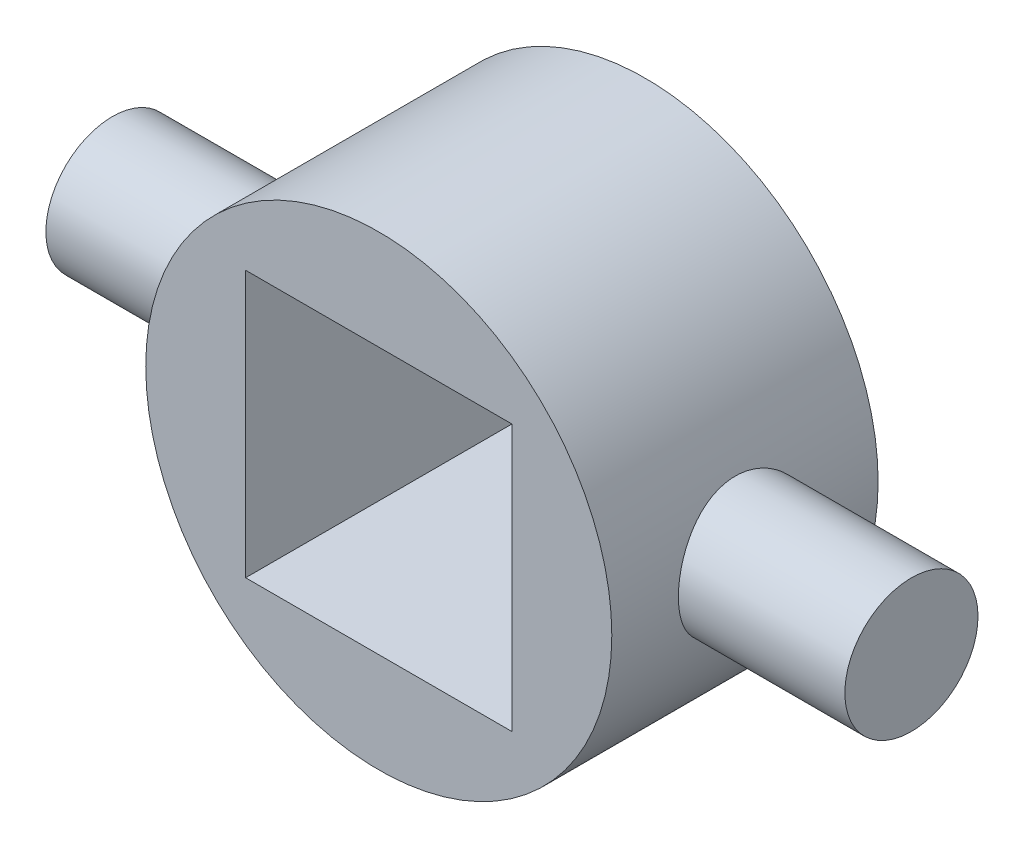
ISO-10303-21;
HEADER;
FILE_DESCRIPTION(('STEP AP214'),'2;1');
FILE_NAME('part.step','',(''),(''),'','','');
FILE_SCHEMA(('AUTOMOTIVE_DESIGN { 1 0 10303 214 1 1 1 1 }'));
ENDSEC;
DATA;
#1=APPLICATION_CONTEXT('core data for automotive mechanical design processes');
#2=APPLICATION_PROTOCOL_DEFINITION('international standard','automotive_design',2000,#1);
#3=PRODUCT_CONTEXT('',#1,'mechanical');
#4=PRODUCT('Part','Part','',(#3));
#5=PRODUCT_RELATED_PRODUCT_CATEGORY('part','',(#4));
#6=PRODUCT_DEFINITION_FORMATION('','',#4);
#7=PRODUCT_DEFINITION_CONTEXT('part definition',#1,'design');
#8=PRODUCT_DEFINITION('design','',#6,#7);
#9=PRODUCT_DEFINITION_SHAPE('','',#8);
#10=(LENGTH_UNIT() NAMED_UNIT(*) SI_UNIT(.MILLI.,.METRE.));
#11=(NAMED_UNIT(*) PLANE_ANGLE_UNIT() SI_UNIT($,.RADIAN.));
#12=(NAMED_UNIT(*) SI_UNIT($,.STERADIAN.) SOLID_ANGLE_UNIT());
#13=UNCERTAINTY_MEASURE_WITH_UNIT(LENGTH_MEASURE(1.E-05),#10,'distance_accuracy_value','');
#14=(GEOMETRIC_REPRESENTATION_CONTEXT(3) GLOBAL_UNCERTAINTY_ASSIGNED_CONTEXT((#13)) GLOBAL_UNIT_ASSIGNED_CONTEXT((#10,
#11,#12)) REPRESENTATION_CONTEXT('',''));
#15=CARTESIAN_POINT('',(0.,0.,0.));
#16=DIRECTION('',(0.,0.,1.));
#17=DIRECTION('',(1.,0.,0.));
#18=AXIS2_PLACEMENT_3D('',#15,#16,#17);
#19=CARTESIAN_POINT('',(0.,0.,20.));
#20=DIRECTION('',(0.,0.,-1.));
#21=DIRECTION('',(-1.,0.,0.));
#22=AXIS2_PLACEMENT_3D('',#19,#20,#21);
#23=CYLINDRICAL_SURFACE('',#22,17.5);
#24=CARTESIAN_POINT('',(-17.5,0.,15.));
#25=CARTESIAN_POINT('',(-17.4999967323586,-0.274887255943128,14.9999951510951));
#26=CARTESIAN_POINT('',(-17.4934604350511,-0.549824369681454,14.9772555275597));
#27=CARTESIAN_POINT('',(-17.4680226486276,-1.09172997799247,14.8870893247442));
#28=CARTESIAN_POINT('',(-17.4491164802521,-1.35869541707404,14.8196458348148));
#29=CARTESIAN_POINT('',(-17.4010172837268,-1.87676075184468,14.6424799039587));
#30=CARTESIAN_POINT('',(-17.3718386026585,-2.12788220212056,14.5328164096201));
#31=CARTESIAN_POINT('',(-17.3062494579136,-2.60817190282318,14.2745550213041));
#32=CARTESIAN_POINT('',(-17.2698382377007,-2.83733785294541,14.1259530537741));
#33=CARTESIAN_POINT('',(-17.1926183656394,-3.27323611714736,13.7899124733177));
#34=CARTESIAN_POINT('',(-17.1517260486293,-3.47930930595233,13.6016381153618));
#35=CARTESIAN_POINT('',(-17.0706683728915,-3.85742839481089,13.1933806421558));
#36=CARTESIAN_POINT('',(-17.0305031239854,-4.02946919269461,12.9733927809195));
#37=CARTESIAN_POINT('',(-16.9545753718829,-4.33799475016071,12.5025160430226));
#38=CARTESIAN_POINT('',(-16.9189175626436,-4.47369552758351,12.2510950373375));
#39=CARTESIAN_POINT('',(-16.8572835960235,-4.7006292638497,11.7278199706235));
#40=CARTESIAN_POINT('',(-16.8313053561473,-4.79187178889368,11.4559703198242));
#41=CARTESIAN_POINT('',(-16.7928402048755,-4.92496082534619,10.9069130920848));
#42=CARTESIAN_POINT('',(-16.7800244641586,-4.9680138300687,10.6300215930753));
#43=CARTESIAN_POINT('',(-16.7683552051415,-5.00726669473215,10.0726721288899));
#44=CARTESIAN_POINT('',(-16.769498653032,-5.00347673524998,9.79221495189357));
#45=CARTESIAN_POINT('',(-16.7853258599179,-4.95010336906261,9.24532847133277));
#46=CARTESIAN_POINT('',(-16.7995695662338,-4.90200814317314,8.9787391219636));
#47=CARTESIAN_POINT('',(-16.8392837083571,-4.76378465210904,8.45758195085061));
#48=CARTESIAN_POINT('',(-16.8647551590827,-4.67365258702332,8.20301521818008));
#49=CARTESIAN_POINT('',(-16.9244215882327,-4.45276702845641,7.70938438894628));
#50=CARTESIAN_POINT('',(-16.95872291023,-4.32151377932501,7.47055731900275));
#51=CARTESIAN_POINT('',(-17.0321304219627,-4.02245947919414,7.01780859695957));
#52=CARTESIAN_POINT('',(-17.0712376805236,-3.85465029183281,6.80389250566084));
#53=CARTESIAN_POINT('',(-17.151656266434,-3.47975999182637,6.39856906098605));
#54=CARTESIAN_POINT('',(-17.1929951143159,-3.27143718711355,6.20831381008246));
#55=CARTESIAN_POINT('',(-17.2719061804519,-2.82533070596534,5.86518499089878));
#56=CARTESIAN_POINT('',(-17.3094782034438,-2.58754550370467,5.71231335989559));
#57=CARTESIAN_POINT('',(-17.3769132016394,-2.08730768272867,5.44767816306506));
#58=CARTESIAN_POINT('',(-17.4067318874312,-1.82472454452503,5.33614928298958));
#59=CARTESIAN_POINT('',(-17.4549812871891,-1.28348307491866,5.15916527145791));
#60=CARTESIAN_POINT('',(-17.4734148714063,-1.00482881452536,5.09369852688682));
#61=CARTESIAN_POINT('',(-17.4963718628669,-0.449165971610879,5.01256678572638));
#62=CARTESIAN_POINT('',(-17.501331821265,-0.172403367151271,4.99533826156744));
#63=CARTESIAN_POINT('',(-17.4980521176773,0.380066317013958,5.00681816575261));
#64=CARTESIAN_POINT('',(-17.4898140395157,0.655773519392769,5.03552108211481));
#65=CARTESIAN_POINT('',(-17.4613481671301,1.19254658357579,5.13677611079064));
#66=CARTESIAN_POINT('',(-17.4413653254419,1.45379552933711,5.20843295330849));
#67=CARTESIAN_POINT('',(-17.3916999685472,1.9605217155141,5.39250125496169));
#68=CARTESIAN_POINT('',(-17.3620163316471,2.20599712812179,5.50491742722334));
#69=CARTESIAN_POINT('',(-17.2952490292284,2.68010421280008,5.77005834161282));
#70=CARTESIAN_POINT('',(-17.2580190794575,2.90825621635022,5.92360299706335));
#71=CARTESIAN_POINT('',(-17.180448677462,3.33609632014869,6.26563126487773));
#72=CARTESIAN_POINT('',(-17.1401075188813,3.53577792710763,6.45412282516136));
#73=CARTESIAN_POINT('',(-17.0592154907323,3.90776607085016,6.86802335512367));
#74=CARTESIAN_POINT('',(-17.0187009214433,4.07896356851775,7.09443818889789));
#75=CARTESIAN_POINT('',(-16.9434723683839,4.380988290169,7.57365647156141));
#76=CARTESIAN_POINT('',(-16.9087581828186,4.51181691871704,7.82645900192717));
#77=CARTESIAN_POINT('',(-16.8494662810178,4.72843635295665,8.35022802743902));
#78=CARTESIAN_POINT('',(-16.8248350005383,4.81446583099021,8.6210894087477));
#79=CARTESIAN_POINT('',(-16.7885614169356,4.93948625169788,9.17427483893333));
#80=CARTESIAN_POINT('',(-16.7769151780959,4.9784914475439,9.45659538767741));
#81=CARTESIAN_POINT('',(-16.7682925774812,5.00745060616827,10.0132400823757));
#82=CARTESIAN_POINT('',(-16.7707790176036,4.99920069109392,10.2874637614812));
#83=CARTESIAN_POINT('',(-16.7888649275624,4.93811777392153,10.8304368267331));
#84=CARTESIAN_POINT('',(-16.8044639598361,4.88528625949613,11.0991863952422));
#85=CARTESIAN_POINT('',(-16.8466744296963,4.73764922042289,11.6209459278904));
#86=CARTESIAN_POINT('',(-16.8731719264076,4.64327729466074,11.8740884675196));
#87=CARTESIAN_POINT('',(-16.9341825708695,4.41557373253792,12.3611468362388));
#88=CARTESIAN_POINT('',(-16.9686971370099,4.28223520107837,12.5950592531853));
#89=CARTESIAN_POINT('',(-17.0432917237999,3.97516366337116,13.045458804511));
#90=CARTESIAN_POINT('',(-17.0835190794904,3.80023069306842,13.2611034783543));
#91=CARTESIAN_POINT('',(-17.164246127292,3.41714960094824,13.6605597395252));
#92=CARTESIAN_POINT('',(-17.2047458854255,3.20899312682136,13.8443632977772));
#93=CARTESIAN_POINT('',(-17.282698989313,2.75893580216352,14.1795929608164));
#94=CARTESIAN_POINT('',(-17.3200475259364,2.51630625589946,14.330067468174));
#95=CARTESIAN_POINT('',(-17.3862848944483,2.00812632411664,14.5878644625551));
#96=CARTESIAN_POINT('',(-17.4151783467569,1.74258856028685,14.6952105298327));
#97=CARTESIAN_POINT('',(-17.4581836181329,1.23229078833759,14.8521188784886));
#98=CARTESIAN_POINT('',(-17.473742109052,0.989407519060976,14.9074338417114));
#99=CARTESIAN_POINT('',(-17.4946510963036,0.497695921965917,14.9813741431054));
#100=CARTESIAN_POINT('',(-17.5000029583499,0.248868394040229,15.0000043899422));
#101=CARTESIAN_POINT('',(-17.5,0.,15.));
#102=B_SPLINE_CURVE_WITH_KNOTS('',3,(#24,#25,#26,#27,#28,#29,#30,#31,#32,#33,#34,#35,#36,#37,
#38,#39,#40,#41,#42,#43,#44,#45,#46,#47,#48,#49,#50,#51,#52,#53,#54,#55,#56,#57,#58,#59,#60,#61,
#62,#63,#64,#65,#66,#67,#68,#69,#70,#71,#72,#73,#74,#75,#76,#77,#78,#79,#80,#81,#82,#83,#84,#85,
#86,#87,#88,#89,#90,#91,#92,#93,#94,#95,#96,#97,#98,#99,#100,#101),.UNSPECIFIED.,.T.,.F.,(4,2,2,
2,2,2,2,2,2,2,2,2,2,2,2,2,2,2,2,2,2,2,2,2,2,2,2,2,2,2,2,2,2,2,2,2,2,2,4),(0.,0.82374828135586,
1.64780834948795,2.47072203223836,3.29372183858789,4.13619528826953,4.97879494684284,
5.83832688250143,6.69767378862024,7.53498774656874,8.37211973078083,9.18211964575845,
9.99219279470076,10.8125200823279,11.6330301394812,12.4844625151102,13.3359390039338,
14.1921775276588,15.0482001004129,15.8761364425026,16.7039734359138,17.5151285120356,
18.3263774144358,19.1551881336589,19.9841875797423,20.840302622156,21.6963878741801,
22.5478643342011,23.399082644741,24.2181670405214,25.0372241048183,25.8479274074505,
26.6587742501083,27.4966914224279,28.3348195778807,29.1944494744229,30.053608731021,
30.7994867011175,31.5452648608618),.UNSPECIFIED.);
#103=CARTESIAN_POINT('',(-17.5,0.,15.));
#104=VERTEX_POINT('',#103);
#105=EDGE_CURVE('E151',#104,#104,#102,.T.);
#106=ORIENTED_EDGE('',*,*,#105,.T.);
#107=EDGE_LOOP('',(#106));
#108=FACE_BOUND('',#107,.T.);
#109=CARTESIAN_POINT('',(0.,0.,20.));
#110=DIRECTION('',(0.,0.,1.));
#111=DIRECTION('',(1.,0.,0.));
#112=AXIS2_PLACEMENT_3D('',#109,#110,#111);
#113=CIRCLE('',#112,17.5);
#114=CARTESIAN_POINT('',(17.5,0.,20.));
#115=VERTEX_POINT('',#114);
#116=EDGE_CURVE('E46',#115,#115,#113,.T.);
#117=ORIENTED_EDGE('',*,*,#116,.F.);
#118=EDGE_LOOP('',(#117));
#119=FACE_BOUND('',#118,.T.);
#120=CARTESIAN_POINT('',(0.,0.,0.));
#121=DIRECTION('',(0.,0.,1.));
#122=DIRECTION('',(1.,0.,0.));
#123=AXIS2_PLACEMENT_3D('',#120,#121,#122);
#124=CIRCLE('',#123,17.5);
#125=CARTESIAN_POINT('',(17.5,0.,0.));
#126=VERTEX_POINT('',#125);
#127=EDGE_CURVE('E95',#126,#126,#124,.T.);
#128=ORIENTED_EDGE('',*,*,#127,.T.);
#129=EDGE_LOOP('',(#128));
#130=FACE_BOUND('',#129,.T.);
#131=CARTESIAN_POINT('',(17.5,0.,15.));
#132=CARTESIAN_POINT('',(17.4999967323586,-0.274887255943128,14.9999951510951));
#133=CARTESIAN_POINT('',(17.4934604350511,-0.549824369681454,14.9772555275597));
#134=CARTESIAN_POINT('',(17.4680226486276,-1.09172997799247,14.8870893247442));
#135=CARTESIAN_POINT('',(17.4491164802521,-1.35869541707404,14.8196458348148));
#136=CARTESIAN_POINT('',(17.4010172837268,-1.87676075184468,14.6424799039587));
#137=CARTESIAN_POINT('',(17.3718386026585,-2.12788220212056,14.5328164096201));
#138=CARTESIAN_POINT('',(17.3062494579136,-2.60817190282318,14.2745550213041));
#139=CARTESIAN_POINT('',(17.2698382377007,-2.83733785294541,14.1259530537741));
#140=CARTESIAN_POINT('',(17.1926183656394,-3.27323611714736,13.7899124733177));
#141=CARTESIAN_POINT('',(17.1517260486293,-3.47930930595233,13.6016381153618));
#142=CARTESIAN_POINT('',(17.0706683728915,-3.85742839481089,13.1933806421558));
#143=CARTESIAN_POINT('',(17.0305031239854,-4.02946919269461,12.9733927809195));
#144=CARTESIAN_POINT('',(16.9545753718829,-4.33799475016071,12.5025160430226));
#145=CARTESIAN_POINT('',(16.9189175626436,-4.47369552758351,12.2510950373375));
#146=CARTESIAN_POINT('',(16.8572835960235,-4.7006292638497,11.7278199706235));
#147=CARTESIAN_POINT('',(16.8313053561473,-4.79187178889368,11.4559703198242));
#148=CARTESIAN_POINT('',(16.7928402048755,-4.92496082534619,10.9069130920848));
#149=CARTESIAN_POINT('',(16.7800244641586,-4.9680138300687,10.6300215930753));
#150=CARTESIAN_POINT('',(16.7683552051415,-5.00726669473215,10.0726721288899));
#151=CARTESIAN_POINT('',(16.769498653032,-5.00347673524998,9.79221495189357));
#152=CARTESIAN_POINT('',(16.7853258599179,-4.95010336906261,9.24532847133277));
#153=CARTESIAN_POINT('',(16.7995695662338,-4.90200814317314,8.9787391219636));
#154=CARTESIAN_POINT('',(16.8392837083571,-4.76378465210904,8.45758195085061));
#155=CARTESIAN_POINT('',(16.8647551590827,-4.67365258702332,8.20301521818008));
#156=CARTESIAN_POINT('',(16.9244215882327,-4.45276702845641,7.70938438894628));
#157=CARTESIAN_POINT('',(16.95872291023,-4.32151377932501,7.47055731900275));
#158=CARTESIAN_POINT('',(17.0321304219627,-4.02245947919413,7.01780859695957));
#159=CARTESIAN_POINT('',(17.0712376805236,-3.85465029183281,6.80389250566084));
#160=CARTESIAN_POINT('',(17.151656266434,-3.47975999182637,6.39856906098605));
#161=CARTESIAN_POINT('',(17.1929951143159,-3.27143718711354,6.20831381008246));
#162=CARTESIAN_POINT('',(17.2719061804519,-2.82533070596534,5.86518499089878));
#163=CARTESIAN_POINT('',(17.3094782034438,-2.58754550370467,5.71231335989559));
#164=CARTESIAN_POINT('',(17.3769132016394,-2.08730768272867,5.44767816306506));
#165=CARTESIAN_POINT('',(17.4067318874312,-1.82472454452503,5.33614928298958));
#166=CARTESIAN_POINT('',(17.4549812871892,-1.28348307491865,5.15916527145791));
#167=CARTESIAN_POINT('',(17.4734148714063,-1.00482881452536,5.09369852688682));
#168=CARTESIAN_POINT('',(17.4963718628669,-0.449165971610878,5.01256678572638));
#169=CARTESIAN_POINT('',(17.501331821265,-0.172403367151271,4.99533826156744));
#170=CARTESIAN_POINT('',(17.4980521176773,0.380066317013958,5.00681816575261));
#171=CARTESIAN_POINT('',(17.4898140395157,0.65577351939277,5.03552108211481));
#172=CARTESIAN_POINT('',(17.4613481671301,1.19254658357579,5.13677611079064));
#173=CARTESIAN_POINT('',(17.4413653254419,1.45379552933711,5.20843295330849));
#174=CARTESIAN_POINT('',(17.3916999685472,1.9605217155141,5.39250125496169));
#175=CARTESIAN_POINT('',(17.3620163316471,2.20599712812179,5.50491742722334));
#176=CARTESIAN_POINT('',(17.2952490292284,2.68010421280008,5.77005834161282));
#177=CARTESIAN_POINT('',(17.2580190794575,2.90825621635022,5.92360299706335));
#178=CARTESIAN_POINT('',(17.180448677462,3.33609632014869,6.26563126487773));
#179=CARTESIAN_POINT('',(17.1401075188813,3.53577792710763,6.45412282516136));
#180=CARTESIAN_POINT('',(17.0592154907323,3.90776607085016,6.86802335512367));
#181=CARTESIAN_POINT('',(17.0187009214433,4.07896356851775,7.09443818889789));
#182=CARTESIAN_POINT('',(16.9434723683839,4.380988290169,7.57365647156141));
#183=CARTESIAN_POINT('',(16.9087581828186,4.51181691871704,7.82645900192717));
#184=CARTESIAN_POINT('',(16.8494662810178,4.72843635295665,8.35022802743902));
#185=CARTESIAN_POINT('',(16.8248350005383,4.81446583099021,8.6210894087477));
#186=CARTESIAN_POINT('',(16.7885614169356,4.93948625169788,9.17427483893333));
#187=CARTESIAN_POINT('',(16.7769151780959,4.9784914475439,9.45659538767741));
#188=CARTESIAN_POINT('',(16.7682925774812,5.00745060616827,10.0132400823757));
#189=CARTESIAN_POINT('',(16.7707790176036,4.99920069109392,10.2874637614812));
#190=CARTESIAN_POINT('',(16.7888649275624,4.93811777392153,10.8304368267331));
#191=CARTESIAN_POINT('',(16.8044639598361,4.88528625949613,11.0991863952422));
#192=CARTESIAN_POINT('',(16.8466744296963,4.73764922042289,11.6209459278904));
#193=CARTESIAN_POINT('',(16.8731719264076,4.64327729466074,11.8740884675196));
#194=CARTESIAN_POINT('',(16.9341825708695,4.41557373253792,12.3611468362388));
#195=CARTESIAN_POINT('',(16.9686971370099,4.28223520107837,12.5950592531853));
#196=CARTESIAN_POINT('',(17.0432917237999,3.97516366337116,13.045458804511));
#197=CARTESIAN_POINT('',(17.0835190794904,3.80023069306842,13.2611034783543));
#198=CARTESIAN_POINT('',(17.164246127292,3.41714960094824,13.6605597395252));
#199=CARTESIAN_POINT('',(17.2047458854255,3.20899312682136,13.8443632977772));
#200=CARTESIAN_POINT('',(17.282698989313,2.75893580216352,14.1795929608164));
#201=CARTESIAN_POINT('',(17.3200475259364,2.51630625589946,14.330067468174));
#202=CARTESIAN_POINT('',(17.3862848944483,2.00812632411664,14.5878644625551));
#203=CARTESIAN_POINT('',(17.4151783467569,1.74258856028684,14.6952105298327));
#204=CARTESIAN_POINT('',(17.4581836181329,1.23229078833759,14.8521188784886));
#205=CARTESIAN_POINT('',(17.473742109052,0.989407519060977,14.9074338417114));
#206=CARTESIAN_POINT('',(17.4946510963036,0.497695921965918,14.9813741431054));
#207=CARTESIAN_POINT('',(17.5000029583499,0.248868394040229,15.0000043899422));
#208=CARTESIAN_POINT('',(17.5,0.,15.));
#209=B_SPLINE_CURVE_WITH_KNOTS('',3,(#131,#132,#133,#134,#135,#136,#137,#138,#139,#140,#141,
#142,#143,#144,#145,#146,#147,#148,#149,#150,#151,#152,#153,#154,#155,#156,#157,#158,#159,#160,
#161,#162,#163,#164,#165,#166,#167,#168,#169,#170,#171,#172,#173,#174,#175,#176,#177,#178,#179,
#180,#181,#182,#183,#184,#185,#186,#187,#188,#189,#190,#191,#192,#193,#194,#195,#196,#197,#198,
#199,#200,#201,#202,#203,#204,#205,#206,#207,#208),.UNSPECIFIED.,.T.,.F.,(4,2,2,2,2,2,2,2,2,2,2,
2,2,2,2,2,2,2,2,2,2,2,2,2,2,2,2,2,2,2,2,2,2,2,2,2,2,2,4),(0.,0.82374828135586,1.64780834948795,
2.47072203223836,3.29372183858789,4.13619528826953,4.97879494684284,5.83832688250143,
6.69767378862024,7.53498774656874,8.37211973078083,9.18211964575845,9.99219279470076,
10.8125200823279,11.6330301394812,12.4844625151102,13.3359390039338,14.1921775276588,
15.0482001004129,15.8761364425026,16.7039734359138,17.5151285120356,18.3263774144358,
19.1551881336589,19.9841875797423,20.840302622156,21.6963878741801,22.5478643342011,
23.399082644741,24.2181670405214,25.0372241048183,25.8479274074505,26.6587742501083,
27.4966914224279,28.3348195778807,29.1944494744229,30.0536087310211,30.7994867011175,
31.5452648608618),.UNSPECIFIED.);
#210=CARTESIAN_POINT('',(17.5,0.,15.));
#211=VERTEX_POINT('',#210);
#212=EDGE_CURVE('E11',#211,#211,#209,.T.);
#213=ORIENTED_EDGE('',*,*,#212,.F.);
#214=EDGE_LOOP('',(#213));
#215=FACE_BOUND('',#214,.T.);
#216=ADVANCED_FACE('F34',(#108,#119,#130,#215),#23,.T.);
#217=CARTESIAN_POINT('',(0.,0.,20.));
#218=DIRECTION('',(0.,0.,1.));
#219=DIRECTION('',(1.,0.,0.));
#220=AXIS2_PLACEMENT_3D('',#217,#218,#219);
#221=PLANE('',#220);
#222=ORIENTED_EDGE('',*,*,#116,.T.);
#223=EDGE_LOOP('',(#222));
#224=FACE_BOUND('',#223,.T.);
#225=DIRECTION('',(-1.,0.,0.));
#226=VECTOR('',#225,1.);
#227=CARTESIAN_POINT('',(-10.,10.,20.));
#228=LINE('',#227,#226);
#229=CARTESIAN_POINT('',(10.,10.,20.));
#230=VERTEX_POINT('',#229);
#231=CARTESIAN_POINT('',(-10.,10.,20.));
#232=VERTEX_POINT('',#231);
#233=EDGE_CURVE('E87',#230,#232,#228,.T.);
#234=ORIENTED_EDGE('',*,*,#233,.F.);
#235=DIRECTION('',(0.,1.,0.));
#236=VECTOR('',#235,1.);
#237=CARTESIAN_POINT('',(10.,-10.,20.));
#238=LINE('',#237,#236);
#239=CARTESIAN_POINT('',(10.,-10.,20.));
#240=VERTEX_POINT('',#239);
#241=EDGE_CURVE('E79',#240,#230,#238,.T.);
#242=ORIENTED_EDGE('',*,*,#241,.F.);
#243=DIRECTION('',(1.,0.,0.));
#244=VECTOR('',#243,1.);
#245=CARTESIAN_POINT('',(-10.,-10.,20.));
#246=LINE('',#245,#244);
#247=CARTESIAN_POINT('',(-10.,-10.,20.));
#248=VERTEX_POINT('',#247);
#249=EDGE_CURVE('E102',#248,#240,#246,.T.);
#250=ORIENTED_EDGE('',*,*,#249,.F.);
#251=DIRECTION('',(0.,-1.,0.));
#252=VECTOR('',#251,1.);
#253=CARTESIAN_POINT('',(-10.,-10.,20.));
#254=LINE('',#253,#252);
#255=EDGE_CURVE('E100',#232,#248,#254,.T.);
#256=ORIENTED_EDGE('',*,*,#255,.F.);
#257=EDGE_LOOP('',(#234,#242,#250,#256));
#258=FACE_BOUND('',#257,.T.);
#259=ADVANCED_FACE('F99',(#224,#258),#221,.T.);
#260=CARTESIAN_POINT('',(0.,0.,0.));
#261=DIRECTION('',(0.,0.,1.));
#262=DIRECTION('',(1.,0.,0.));
#263=AXIS2_PLACEMENT_3D('',#260,#261,#262);
#264=PLANE('',#263);
#265=ORIENTED_EDGE('',*,*,#127,.F.);
#266=EDGE_LOOP('',(#265));
#267=FACE_BOUND('',#266,.T.);
#268=DIRECTION('',(0.,1.,0.));
#269=VECTOR('',#268,1.);
#270=CARTESIAN_POINT('',(10.,-10.,0.));
#271=LINE('',#270,#269);
#272=CARTESIAN_POINT('',(10.,-10.,0.));
#273=VERTEX_POINT('',#272);
#274=CARTESIAN_POINT('',(10.,10.,0.));
#275=VERTEX_POINT('',#274);
#276=EDGE_CURVE('E61',#273,#275,#271,.T.);
#277=ORIENTED_EDGE('',*,*,#276,.T.);
#278=DIRECTION('',(-1.,0.,0.));
#279=VECTOR('',#278,1.);
#280=CARTESIAN_POINT('',(-10.,10.,0.));
#281=LINE('',#280,#279);
#282=CARTESIAN_POINT('',(-10.,10.,0.));
#283=VERTEX_POINT('',#282);
#284=EDGE_CURVE('E94',#275,#283,#281,.T.);
#285=ORIENTED_EDGE('',*,*,#284,.T.);
#286=DIRECTION('',(0.,-1.,0.));
#287=VECTOR('',#286,1.);
#288=CARTESIAN_POINT('',(-10.,-10.,0.));
#289=LINE('',#288,#287);
#290=CARTESIAN_POINT('',(-10.,-10.,0.));
#291=VERTEX_POINT('',#290);
#292=EDGE_CURVE('E110',#283,#291,#289,.T.);
#293=ORIENTED_EDGE('',*,*,#292,.T.);
#294=DIRECTION('',(1.,0.,0.));
#295=VECTOR('',#294,1.);
#296=CARTESIAN_POINT('',(-10.,-10.,0.));
#297=LINE('',#296,#295);
#298=EDGE_CURVE('E88',#291,#273,#297,.T.);
#299=ORIENTED_EDGE('',*,*,#298,.T.);
#300=EDGE_LOOP('',(#277,#285,#293,#299));
#301=FACE_BOUND('',#300,.T.);
#302=ADVANCED_FACE('F124',(#267,#301),#264,.F.);
#303=CARTESIAN_POINT('',(10.,-10.,20.));
#304=DIRECTION('',(-1.,0.,0.));
#305=DIRECTION('',(0.,0.,1.));
#306=AXIS2_PLACEMENT_3D('',#303,#304,#305);
#307=PLANE('',#306);
#308=ORIENTED_EDGE('',*,*,#276,.F.);
#309=DIRECTION('',(0.,0.,-1.));
#310=VECTOR('',#309,1.);
#311=CARTESIAN_POINT('',(10.,-10.,20.));
#312=LINE('',#311,#310);
#313=EDGE_CURVE('E83',#240,#273,#312,.T.);
#314=ORIENTED_EDGE('',*,*,#313,.F.);
#315=ORIENTED_EDGE('',*,*,#241,.T.);
#316=DIRECTION('',(0.,0.,-1.));
#317=VECTOR('',#316,1.);
#318=CARTESIAN_POINT('',(10.,10.,20.));
#319=LINE('',#318,#317);
#320=EDGE_CURVE('E82',#230,#275,#319,.T.);
#321=ORIENTED_EDGE('',*,*,#320,.T.);
#322=EDGE_LOOP('',(#308,#314,#315,#321));
#323=FACE_BOUND('',#322,.T.);
#324=ADVANCED_FACE('F81',(#323),#307,.T.);
#325=CARTESIAN_POINT('',(-10.,10.,20.));
#326=DIRECTION('',(0.,-1.,0.));
#327=DIRECTION('',(0.,0.,-1.));
#328=AXIS2_PLACEMENT_3D('',#325,#326,#327);
#329=PLANE('',#328);
#330=ORIENTED_EDGE('',*,*,#284,.F.);
#331=ORIENTED_EDGE('',*,*,#320,.F.);
#332=ORIENTED_EDGE('',*,*,#233,.T.);
#333=DIRECTION('',(0.,0.,-1.));
#334=VECTOR('',#333,1.);
#335=CARTESIAN_POINT('',(-10.,10.,20.));
#336=LINE('',#335,#334);
#337=EDGE_CURVE('E96',#232,#283,#336,.T.);
#338=ORIENTED_EDGE('',*,*,#337,.T.);
#339=EDGE_LOOP('',(#330,#331,#332,#338));
#340=FACE_BOUND('',#339,.T.);
#341=ADVANCED_FACE('F91',(#340),#329,.T.);
#342=CARTESIAN_POINT('',(-10.,-10.,20.));
#343=DIRECTION('',(1.,0.,0.));
#344=DIRECTION('',(0.,0.,-1.));
#345=AXIS2_PLACEMENT_3D('',#342,#343,#344);
#346=PLANE('',#345);
#347=ORIENTED_EDGE('',*,*,#292,.F.);
#348=ORIENTED_EDGE('',*,*,#337,.F.);
#349=ORIENTED_EDGE('',*,*,#255,.T.);
#350=DIRECTION('',(0.,0.,-1.));
#351=VECTOR('',#350,1.);
#352=CARTESIAN_POINT('',(-10.,-10.,20.));
#353=LINE('',#352,#351);
#354=EDGE_CURVE('E53',#248,#291,#353,.T.);
#355=ORIENTED_EDGE('',*,*,#354,.T.);
#356=EDGE_LOOP('',(#347,#348,#349,#355));
#357=FACE_BOUND('',#356,.T.);
#358=ADVANCED_FACE('F131',(#357),#346,.T.);
#359=CARTESIAN_POINT('',(-10.,-10.,20.));
#360=DIRECTION('',(0.,1.,0.));
#361=DIRECTION('',(0.,0.,1.));
#362=AXIS2_PLACEMENT_3D('',#359,#360,#361);
#363=PLANE('',#362);
#364=ORIENTED_EDGE('',*,*,#298,.F.);
#365=ORIENTED_EDGE('',*,*,#354,.F.);
#366=ORIENTED_EDGE('',*,*,#249,.T.);
#367=ORIENTED_EDGE('',*,*,#313,.T.);
#368=EDGE_LOOP('',(#364,#365,#366,#367));
#369=FACE_BOUND('',#368,.T.);
#370=ADVANCED_FACE('F128',(#369),#363,.T.);
#371=CARTESIAN_POINT('',(30.,0.,10.));
#372=DIRECTION('',(-1.,0.,0.));
#373=DIRECTION('',(0.,0.,1.));
#374=AXIS2_PLACEMENT_3D('',#371,#372,#373);
#375=CYLINDRICAL_SURFACE('',#374,5.);
#376=CARTESIAN_POINT('',(30.,0.,10.));
#377=DIRECTION('',(1.,0.,0.));
#378=DIRECTION('',(0.,0.,-1.));
#379=AXIS2_PLACEMENT_3D('',#376,#377,#378);
#380=CIRCLE('',#379,5.);
#381=CARTESIAN_POINT('',(30.,0.,5.00000000000001));
#382=VERTEX_POINT('',#381);
#383=EDGE_CURVE('E108',#382,#382,#380,.T.);
#384=ORIENTED_EDGE('',*,*,#383,.F.);
#385=EDGE_LOOP('',(#384));
#386=FACE_BOUND('',#385,.T.);
#387=ORIENTED_EDGE('',*,*,#212,.T.);
#388=EDGE_LOOP('',(#387));
#389=FACE_BOUND('',#388,.T.);
#390=ADVANCED_FACE('F130',(#386,#389),#375,.T.);
#391=CARTESIAN_POINT('',(30.,0.,10.));
#392=DIRECTION('',(1.,0.,0.));
#393=DIRECTION('',(0.,0.,-1.));
#394=AXIS2_PLACEMENT_3D('',#391,#392,#393);
#395=PLANE('',#394);
#396=ORIENTED_EDGE('',*,*,#383,.T.);
#397=EDGE_LOOP('',(#396));
#398=FACE_BOUND('',#397,.T.);
#399=ADVANCED_FACE('F137',(#398),#395,.T.);
#400=CARTESIAN_POINT('',(-30.,0.,10.));
#401=DIRECTION('',(1.,0.,0.));
#402=DIRECTION('',(0.,0.,-1.));
#403=AXIS2_PLACEMENT_3D('',#400,#401,#402);
#404=CYLINDRICAL_SURFACE('',#403,5.);
#405=CARTESIAN_POINT('',(-30.,0.,10.));
#406=DIRECTION('',(1.,0.,0.));
#407=DIRECTION('',(0.,0.,-1.));
#408=AXIS2_PLACEMENT_3D('',#405,#406,#407);
#409=CIRCLE('',#408,5.);
#410=CARTESIAN_POINT('',(-30.,0.,5.00000000000001));
#411=VERTEX_POINT('',#410);
#412=EDGE_CURVE('E154',#411,#411,#409,.T.);
#413=ORIENTED_EDGE('',*,*,#412,.T.);
#414=EDGE_LOOP('',(#413));
#415=FACE_BOUND('',#414,.T.);
#416=ORIENTED_EDGE('',*,*,#105,.F.);
#417=EDGE_LOOP('',(#416));
#418=FACE_BOUND('',#417,.T.);
#419=ADVANCED_FACE('F169',(#415,#418),#404,.T.);
#420=CARTESIAN_POINT('',(-30.,0.,10.));
#421=DIRECTION('',(-1.,0.,0.));
#422=DIRECTION('',(0.,0.,-1.));
#423=AXIS2_PLACEMENT_3D('',#420,#421,#422);
#424=PLANE('',#423);
#425=ORIENTED_EDGE('',*,*,#412,.F.);
#426=EDGE_LOOP('',(#425));
#427=FACE_BOUND('',#426,.T.);
#428=ADVANCED_FACE('F166',(#427),#424,.T.);
#429=CLOSED_SHELL('',(#216,#259,#302,#324,#341,#358,#370,#390,#399,#419,#428));
#430=MANIFOLD_SOLID_BREP('B2',#429);
#431=ADVANCED_BREP_SHAPE_REPRESENTATION('',(#18,#430),#14);
#432=SHAPE_DEFINITION_REPRESENTATION(#9,#431);
ENDSEC;
END-ISO-10303-21;
